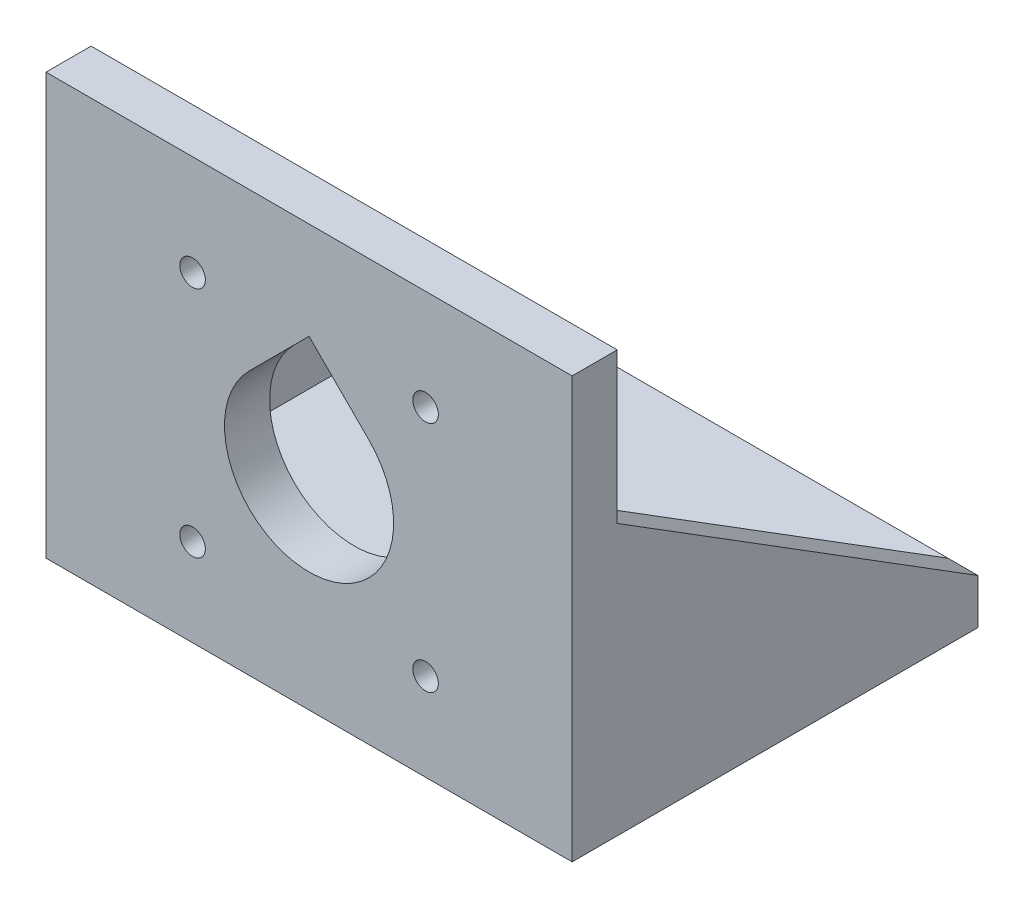
ISO-10303-21;
HEADER;
FILE_DESCRIPTION(('STEP AP214'),'2;1');
FILE_NAME('part.step','',(''),(''),'','','');
FILE_SCHEMA(('AUTOMOTIVE_DESIGN { 1 0 10303 214 1 1 1 1 }'));
ENDSEC;
DATA;
#1=APPLICATION_CONTEXT('core data for automotive mechanical design processes');
#2=APPLICATION_PROTOCOL_DEFINITION('international standard','automotive_design',2000,#1);
#3=PRODUCT_CONTEXT('',#1,'mechanical');
#4=PRODUCT('Part','Part','',(#3));
#5=PRODUCT_RELATED_PRODUCT_CATEGORY('part','',(#4));
#6=PRODUCT_DEFINITION_FORMATION('','',#4);
#7=PRODUCT_DEFINITION_CONTEXT('part definition',#1,'design');
#8=PRODUCT_DEFINITION('design','',#6,#7);
#9=PRODUCT_DEFINITION_SHAPE('','',#8);
#10=(LENGTH_UNIT() NAMED_UNIT(*) SI_UNIT(.MILLI.,.METRE.));
#11=(NAMED_UNIT(*) PLANE_ANGLE_UNIT() SI_UNIT($,.RADIAN.));
#12=(NAMED_UNIT(*) SI_UNIT($,.STERADIAN.) SOLID_ANGLE_UNIT());
#13=UNCERTAINTY_MEASURE_WITH_UNIT(LENGTH_MEASURE(1.E-05),#10,'distance_accuracy_value','');
#14=(GEOMETRIC_REPRESENTATION_CONTEXT(3) GLOBAL_UNCERTAINTY_ASSIGNED_CONTEXT((#13)) GLOBAL_UNIT_ASSIGNED_CONTEXT((#10,
#11,#12)) REPRESENTATION_CONTEXT('',''));
#15=CARTESIAN_POINT('',(0.,0.,0.));
#16=DIRECTION('',(0.,0.,1.));
#17=DIRECTION('',(1.,0.,0.));
#18=AXIS2_PLACEMENT_3D('',#15,#16,#17);
#19=CARTESIAN_POINT('',(0.,0.,0.));
#20=DIRECTION('',(0.,0.,-1.));
#21=DIRECTION('',(-1.,0.,0.));
#22=AXIS2_PLACEMENT_3D('',#19,#20,#21);
#23=PLANE('',#22);
#24=DIRECTION('',(0.707106781186548,0.707106781186548,0.));
#25=VECTOR('',#24,1.);
#26=CARTESIAN_POINT('',(-4.02995128834866,4.02995128834866,0.));
#27=LINE('',#26,#25);
#28=CARTESIAN_POINT('',(27.0450487116513,35.1049512883487,0.));
#29=VERTEX_POINT('',#28);
#30=CARTESIAN_POINT('',(35.,43.0599025766973,0.));
#31=VERTEX_POINT('',#30);
#32=EDGE_CURVE('E268',#29,#31,#27,.T.);
#33=ORIENTED_EDGE('',*,*,#32,.F.);
#34=CARTESIAN_POINT('',(35.,27.15,0.));
#35=DIRECTION('',(0.,0.,-1.));
#36=DIRECTION('',(-1.,0.,0.));
#37=AXIS2_PLACEMENT_3D('',#34,#35,#36);
#38=CIRCLE('',#37,11.25);
#39=CARTESIAN_POINT('',(42.9549512883487,35.1049512883487,0.));
#40=VERTEX_POINT('',#39);
#41=EDGE_CURVE('E149',#40,#29,#38,.T.);
#42=ORIENTED_EDGE('',*,*,#41,.F.);
#43=DIRECTION('',(0.707106781186548,-0.707106781186548,0.));
#44=VECTOR('',#43,1.);
#45=CARTESIAN_POINT('',(39.0299512883487,39.0299512883487,0.));
#46=LINE('',#45,#44);
#47=EDGE_CURVE('E136',#31,#40,#46,.T.);
#48=ORIENTED_EDGE('',*,*,#47,.F.);
#49=EDGE_LOOP('',(#33,#42,#48));
#50=FACE_BOUND('',#49,.T.);
#51=CARTESIAN_POINT('',(50.5,42.65,0.));
#52=DIRECTION('',(0.,0.,-1.));
#53=DIRECTION('',(-1.,0.,0.));
#54=AXIS2_PLACEMENT_3D('',#51,#52,#53);
#55=CIRCLE('',#54,1.7);
#56=CARTESIAN_POINT('',(48.8,42.65,0.));
#57=VERTEX_POINT('',#56);
#58=EDGE_CURVE('E169',#57,#57,#55,.T.);
#59=ORIENTED_EDGE('',*,*,#58,.F.);
#60=EDGE_LOOP('',(#59));
#61=FACE_BOUND('',#60,.T.);
#62=CARTESIAN_POINT('',(50.5,11.65,0.));
#63=DIRECTION('',(0.,0.,-1.));
#64=DIRECTION('',(-1.,0.,0.));
#65=AXIS2_PLACEMENT_3D('',#62,#63,#64);
#66=CIRCLE('',#65,1.7);
#67=CARTESIAN_POINT('',(48.8,11.65,0.));
#68=VERTEX_POINT('',#67);
#69=EDGE_CURVE('E166',#68,#68,#66,.T.);
#70=ORIENTED_EDGE('',*,*,#69,.F.);
#71=EDGE_LOOP('',(#70));
#72=FACE_BOUND('',#71,.T.);
#73=CARTESIAN_POINT('',(19.5,42.65,0.));
#74=DIRECTION('',(0.,0.,-1.));
#75=DIRECTION('',(-1.,0.,0.));
#76=AXIS2_PLACEMENT_3D('',#73,#74,#75);
#77=CIRCLE('',#76,1.7);
#78=CARTESIAN_POINT('',(17.8,42.65,0.));
#79=VERTEX_POINT('',#78);
#80=EDGE_CURVE('E163',#79,#79,#77,.T.);
#81=ORIENTED_EDGE('',*,*,#80,.F.);
#82=EDGE_LOOP('',(#81));
#83=FACE_BOUND('',#82,.T.);
#84=CARTESIAN_POINT('',(19.5,11.65,0.));
#85=DIRECTION('',(0.,0.,-1.));
#86=DIRECTION('',(-1.,0.,0.));
#87=AXIS2_PLACEMENT_3D('',#84,#85,#86);
#88=CIRCLE('',#87,1.7);
#89=CARTESIAN_POINT('',(17.8,11.65,0.));
#90=VERTEX_POINT('',#89);
#91=EDGE_CURVE('E152',#90,#90,#88,.T.);
#92=ORIENTED_EDGE('',*,*,#91,.F.);
#93=EDGE_LOOP('',(#92));
#94=FACE_BOUND('',#93,.T.);
#95=DIRECTION('',(0.,1.,0.));
#96=VECTOR('',#95,1.);
#97=CARTESIAN_POINT('',(70.,0.,0.));
#98=LINE('',#97,#96);
#99=CARTESIAN_POINT('',(70.,36.,0.));
#100=VERTEX_POINT('',#99);
#101=CARTESIAN_POINT('',(70.,56.,0.));
#102=VERTEX_POINT('',#101);
#103=EDGE_CURVE('E226',#100,#102,#98,.T.);
#104=ORIENTED_EDGE('',*,*,#103,.F.);
#105=DIRECTION('',(-1.,0.,0.));
#106=VECTOR('',#105,1.);
#107=CARTESIAN_POINT('',(70.,36.,0.));
#108=LINE('',#107,#106);
#109=CARTESIAN_POINT('',(66.,36.,0.));
#110=VERTEX_POINT('',#109);
#111=EDGE_CURVE('E174',#100,#110,#108,.T.);
#112=ORIENTED_EDGE('',*,*,#111,.T.);
#113=DIRECTION('',(0.,-1.,0.));
#114=VECTOR('',#113,1.);
#115=CARTESIAN_POINT('',(66.,5.99999999999999,0.));
#116=LINE('',#115,#114);
#117=CARTESIAN_POINT('',(66.,5.99999999999999,0.));
#118=VERTEX_POINT('',#117);
#119=EDGE_CURVE('E177',#110,#118,#116,.T.);
#120=ORIENTED_EDGE('',*,*,#119,.T.);
#121=DIRECTION('',(1.,0.,0.));
#122=VECTOR('',#121,1.);
#123=CARTESIAN_POINT('',(0.,6.,0.));
#124=LINE('',#123,#122);
#125=CARTESIAN_POINT('',(4.,6.,0.));
#126=VERTEX_POINT('',#125);
#127=EDGE_CURVE('E238',#126,#118,#124,.T.);
#128=ORIENTED_EDGE('',*,*,#127,.F.);
#129=DIRECTION('',(0.,-1.,0.));
#130=VECTOR('',#129,1.);
#131=CARTESIAN_POINT('',(4.,5.99999999999999,0.));
#132=LINE('',#131,#130);
#133=CARTESIAN_POINT('',(4.,36.,0.));
#134=VERTEX_POINT('',#133);
#135=EDGE_CURVE('E188',#134,#126,#132,.T.);
#136=ORIENTED_EDGE('',*,*,#135,.F.);
#137=DIRECTION('',(-1.,0.,0.));
#138=VECTOR('',#137,1.);
#139=CARTESIAN_POINT('',(4.,36.,0.));
#140=LINE('',#139,#138);
#141=CARTESIAN_POINT('',(0.,36.,0.));
#142=VERTEX_POINT('',#141);
#143=EDGE_CURVE('E199',#134,#142,#140,.T.);
#144=ORIENTED_EDGE('',*,*,#143,.T.);
#145=DIRECTION('',(0.,-1.,0.));
#146=VECTOR('',#145,1.);
#147=CARTESIAN_POINT('',(0.,0.,0.));
#148=LINE('',#147,#146);
#149=CARTESIAN_POINT('',(0.,56.,0.));
#150=VERTEX_POINT('',#149);
#151=EDGE_CURVE('E213',#150,#142,#148,.T.);
#152=ORIENTED_EDGE('',*,*,#151,.F.);
#153=DIRECTION('',(-1.,0.,0.));
#154=VECTOR('',#153,1.);
#155=CARTESIAN_POINT('',(0.,56.,0.));
#156=LINE('',#155,#154);
#157=EDGE_CURVE('E217',#102,#150,#156,.T.);
#158=ORIENTED_EDGE('',*,*,#157,.F.);
#159=EDGE_LOOP('',(#104,#112,#120,#128,#136,#144,#152,#158));
#160=FACE_BOUND('',#159,.T.);
#161=ADVANCED_FACE('F41',(#50,#61,#72,#83,#94,#160),#23,.T.);
#162=CARTESIAN_POINT('',(0.,6.,0.));
#163=DIRECTION('',(0.,1.,0.));
#164=DIRECTION('',(0.,0.,1.));
#165=AXIS2_PLACEMENT_3D('',#162,#163,#164);
#166=PLANE('',#165);
#167=CARTESIAN_POINT('',(8.5,6.,-38.));
#168=DIRECTION('',(0.,1.,0.));
#169=DIRECTION('',(0.,0.,1.));
#170=AXIS2_PLACEMENT_3D('',#167,#168,#169);
#171=CIRCLE('',#170,2.25);
#172=CARTESIAN_POINT('',(8.5,6.,-35.75));
#173=VERTEX_POINT('',#172);
#174=EDGE_CURVE('E262',#173,#173,#171,.T.);
#175=ORIENTED_EDGE('',*,*,#174,.F.);
#176=EDGE_LOOP('',(#175));
#177=FACE_BOUND('',#176,.T.);
#178=CARTESIAN_POINT('',(61.5,6.,-12.));
#179=DIRECTION('',(0.,1.,0.));
#180=DIRECTION('',(0.,0.,1.));
#181=AXIS2_PLACEMENT_3D('',#178,#179,#180);
#182=CIRCLE('',#181,2.24999999999999);
#183=CARTESIAN_POINT('',(61.5,6.,-9.75000000000001));
#184=VERTEX_POINT('',#183);
#185=EDGE_CURVE('E251',#184,#184,#182,.T.);
#186=ORIENTED_EDGE('',*,*,#185,.F.);
#187=EDGE_LOOP('',(#186));
#188=FACE_BOUND('',#187,.T.);
#189=CARTESIAN_POINT('',(61.5,6.,-38.));
#190=DIRECTION('',(0.,1.,0.));
#191=DIRECTION('',(0.,0.,1.));
#192=AXIS2_PLACEMENT_3D('',#189,#190,#191);
#193=CIRCLE('',#192,2.24999999999999);
#194=CARTESIAN_POINT('',(61.5,6.,-35.75));
#195=VERTEX_POINT('',#194);
#196=EDGE_CURVE('E248',#195,#195,#193,.T.);
#197=ORIENTED_EDGE('',*,*,#196,.F.);
#198=EDGE_LOOP('',(#197));
#199=FACE_BOUND('',#198,.T.);
#200=CARTESIAN_POINT('',(8.5,6.,-12.));
#201=DIRECTION('',(0.,1.,0.));
#202=DIRECTION('',(0.,0.,1.));
#203=AXIS2_PLACEMENT_3D('',#200,#201,#202);
#204=CIRCLE('',#203,2.25);
#205=CARTESIAN_POINT('',(8.5,6.,-9.75));
#206=VERTEX_POINT('',#205);
#207=EDGE_CURVE('E245',#206,#206,#204,.T.);
#208=ORIENTED_EDGE('',*,*,#207,.F.);
#209=EDGE_LOOP('',(#208));
#210=FACE_BOUND('',#209,.T.);
#211=ORIENTED_EDGE('',*,*,#127,.T.);
#212=DIRECTION('',(0.,0.,-1.));
#213=VECTOR('',#212,1.);
#214=CARTESIAN_POINT('',(66.,6.,-48.));
#215=LINE('',#214,#213);
#216=CARTESIAN_POINT('',(66.,6.,-48.));
#217=VERTEX_POINT('',#216);
#218=EDGE_CURVE('E175',#118,#217,#215,.T.);
#219=ORIENTED_EDGE('',*,*,#218,.T.);
#220=DIRECTION('',(-1.,0.,0.));
#221=VECTOR('',#220,1.);
#222=CARTESIAN_POINT('',(0.,6.,-48.));
#223=LINE('',#222,#221);
#224=CARTESIAN_POINT('',(4.,6.,-48.));
#225=VERTEX_POINT('',#224);
#226=EDGE_CURVE('E205',#217,#225,#223,.T.);
#227=ORIENTED_EDGE('',*,*,#226,.T.);
#228=DIRECTION('',(0.,0.,-1.));
#229=VECTOR('',#228,1.);
#230=CARTESIAN_POINT('',(4.,6.,-48.));
#231=LINE('',#230,#229);
#232=EDGE_CURVE('E191',#126,#225,#231,.T.);
#233=ORIENTED_EDGE('',*,*,#232,.F.);
#234=EDGE_LOOP('',(#211,#219,#227,#233));
#235=FACE_BOUND('',#234,.T.);
#236=ADVANCED_FACE('F307',(#177,#188,#199,#210,#235),#166,.T.);
#237=CARTESIAN_POINT('',(0.,0.,6.));
#238=DIRECTION('',(1.,0.,0.));
#239=DIRECTION('',(0.,0.,-1.));
#240=AXIS2_PLACEMENT_3D('',#237,#238,#239);
#241=PLANE('',#240);
#242=ORIENTED_EDGE('',*,*,#151,.T.);
#243=DIRECTION('',(0.,0.52999894000318,0.847998304005088));
#244=VECTOR('',#243,1.);
#245=CARTESIAN_POINT('',(0.,36.,0.));
#246=LINE('',#245,#244);
#247=CARTESIAN_POINT('',(0.,6.,-48.));
#248=VERTEX_POINT('',#247);
#249=EDGE_CURVE('E184',#248,#142,#246,.T.);
#250=ORIENTED_EDGE('',*,*,#249,.F.);
#251=DIRECTION('',(0.,-1.,0.));
#252=VECTOR('',#251,1.);
#253=CARTESIAN_POINT('',(0.,6.,-48.));
#254=LINE('',#253,#252);
#255=CARTESIAN_POINT('',(0.,0.,-48.));
#256=VERTEX_POINT('',#255);
#257=EDGE_CURVE('E204',#248,#256,#254,.T.);
#258=ORIENTED_EDGE('',*,*,#257,.T.);
#259=DIRECTION('',(0.,0.,-1.));
#260=VECTOR('',#259,1.);
#261=CARTESIAN_POINT('',(0.,0.,6.));
#262=LINE('',#261,#260);
#263=CARTESIAN_POINT('',(0.,0.,6.));
#264=VERTEX_POINT('',#263);
#265=EDGE_CURVE('E236',#264,#256,#262,.T.);
#266=ORIENTED_EDGE('',*,*,#265,.F.);
#267=DIRECTION('',(0.,-1.,0.));
#268=VECTOR('',#267,1.);
#269=CARTESIAN_POINT('',(0.,0.,6.));
#270=LINE('',#269,#268);
#271=CARTESIAN_POINT('',(0.,56.,6.));
#272=VERTEX_POINT('',#271);
#273=EDGE_CURVE('E214',#272,#264,#270,.T.);
#274=ORIENTED_EDGE('',*,*,#273,.F.);
#275=DIRECTION('',(0.,0.,-1.));
#276=VECTOR('',#275,1.);
#277=CARTESIAN_POINT('',(0.,56.,6.));
#278=LINE('',#277,#276);
#279=EDGE_CURVE('E223',#272,#150,#278,.T.);
#280=ORIENTED_EDGE('',*,*,#279,.T.);
#281=EDGE_LOOP('',(#242,#250,#258,#266,#274,#280));
#282=FACE_BOUND('',#281,.T.);
#283=ADVANCED_FACE('F43',(#282),#241,.F.);
#284=CARTESIAN_POINT('',(0.,0.,6.));
#285=DIRECTION('',(0.,1.,0.));
#286=DIRECTION('',(0.,0.,1.));
#287=AXIS2_PLACEMENT_3D('',#284,#285,#286);
#288=PLANE('',#287);
#289=CARTESIAN_POINT('',(8.5,0.,-38.));
#290=DIRECTION('',(0.,1.,0.));
#291=DIRECTION('',(0.,0.,1.));
#292=AXIS2_PLACEMENT_3D('',#289,#290,#291);
#293=CIRCLE('',#292,2.25);
#294=CARTESIAN_POINT('',(8.5,0.,-35.75));
#295=VERTEX_POINT('',#294);
#296=EDGE_CURVE('E45',#295,#295,#293,.T.);
#297=ORIENTED_EDGE('',*,*,#296,.T.);
#298=EDGE_LOOP('',(#297));
#299=FACE_BOUND('',#298,.T.);
#300=CARTESIAN_POINT('',(61.5,0.,-12.));
#301=DIRECTION('',(0.,1.,0.));
#302=DIRECTION('',(0.,0.,1.));
#303=AXIS2_PLACEMENT_3D('',#300,#301,#302);
#304=CIRCLE('',#303,2.24999999999999);
#305=CARTESIAN_POINT('',(61.5,0.,-9.75000000000001));
#306=VERTEX_POINT('',#305);
#307=EDGE_CURVE('E249',#306,#306,#304,.T.);
#308=ORIENTED_EDGE('',*,*,#307,.T.);
#309=EDGE_LOOP('',(#308));
#310=FACE_BOUND('',#309,.T.);
#311=CARTESIAN_POINT('',(61.5,0.,-38.));
#312=DIRECTION('',(0.,1.,0.));
#313=DIRECTION('',(0.,0.,1.));
#314=AXIS2_PLACEMENT_3D('',#311,#312,#313);
#315=CIRCLE('',#314,2.24999999999999);
#316=CARTESIAN_POINT('',(61.5,0.,-35.75));
#317=VERTEX_POINT('',#316);
#318=EDGE_CURVE('E246',#317,#317,#315,.T.);
#319=ORIENTED_EDGE('',*,*,#318,.T.);
#320=EDGE_LOOP('',(#319));
#321=FACE_BOUND('',#320,.T.);
#322=CARTESIAN_POINT('',(8.5,0.,-12.));
#323=DIRECTION('',(0.,1.,0.));
#324=DIRECTION('',(0.,0.,1.));
#325=AXIS2_PLACEMENT_3D('',#322,#323,#324);
#326=CIRCLE('',#325,2.25);
#327=CARTESIAN_POINT('',(8.5,0.,-9.75));
#328=VERTEX_POINT('',#327);
#329=EDGE_CURVE('E242',#328,#328,#326,.T.);
#330=ORIENTED_EDGE('',*,*,#329,.T.);
#331=EDGE_LOOP('',(#330));
#332=FACE_BOUND('',#331,.T.);
#333=ORIENTED_EDGE('',*,*,#265,.T.);
#334=DIRECTION('',(-1.,0.,0.));
#335=VECTOR('',#334,1.);
#336=CARTESIAN_POINT('',(0.,0.,-48.));
#337=LINE('',#336,#335);
#338=CARTESIAN_POINT('',(70.,0.,-48.));
#339=VERTEX_POINT('',#338);
#340=EDGE_CURVE('E201',#339,#256,#337,.T.);
#341=ORIENTED_EDGE('',*,*,#340,.F.);
#342=DIRECTION('',(0.,0.,-1.));
#343=VECTOR('',#342,1.);
#344=CARTESIAN_POINT('',(70.,0.,6.));
#345=LINE('',#344,#343);
#346=CARTESIAN_POINT('',(70.,0.,6.));
#347=VERTEX_POINT('',#346);
#348=EDGE_CURVE('E234',#347,#339,#345,.T.);
#349=ORIENTED_EDGE('',*,*,#348,.F.);
#350=DIRECTION('',(1.,0.,0.));
#351=VECTOR('',#350,1.);
#352=CARTESIAN_POINT('',(0.,0.,6.));
#353=LINE('',#352,#351);
#354=EDGE_CURVE('E216',#264,#347,#353,.T.);
#355=ORIENTED_EDGE('',*,*,#354,.F.);
#356=EDGE_LOOP('',(#333,#341,#349,#355));
#357=FACE_BOUND('',#356,.T.);
#358=ADVANCED_FACE('F325',(#299,#310,#321,#332,#357),#288,.F.);
#359=CARTESIAN_POINT('',(70.,0.,6.));
#360=DIRECTION('',(-1.,0.,0.));
#361=DIRECTION('',(0.,0.,1.));
#362=AXIS2_PLACEMENT_3D('',#359,#360,#361);
#363=PLANE('',#362);
#364=DIRECTION('',(0.,0.52999894000318,0.847998304005088));
#365=VECTOR('',#364,1.);
#366=CARTESIAN_POINT('',(70.,36.,0.));
#367=LINE('',#366,#365);
#368=CARTESIAN_POINT('',(70.,6.,-48.));
#369=VERTEX_POINT('',#368);
#370=EDGE_CURVE('E172',#369,#100,#367,.T.);
#371=ORIENTED_EDGE('',*,*,#370,.T.);
#372=ORIENTED_EDGE('',*,*,#103,.T.);
#373=DIRECTION('',(0.,0.,-1.));
#374=VECTOR('',#373,1.);
#375=CARTESIAN_POINT('',(70.,56.,6.));
#376=LINE('',#375,#374);
#377=CARTESIAN_POINT('',(70.,56.,6.));
#378=VERTEX_POINT('',#377);
#379=EDGE_CURVE('E231',#378,#102,#376,.T.);
#380=ORIENTED_EDGE('',*,*,#379,.F.);
#381=DIRECTION('',(0.,1.,0.));
#382=VECTOR('',#381,1.);
#383=CARTESIAN_POINT('',(70.,0.,6.));
#384=LINE('',#383,#382);
#385=EDGE_CURVE('E219',#347,#378,#384,.T.);
#386=ORIENTED_EDGE('',*,*,#385,.F.);
#387=ORIENTED_EDGE('',*,*,#348,.T.);
#388=DIRECTION('',(0.,-1.,0.));
#389=VECTOR('',#388,1.);
#390=CARTESIAN_POINT('',(70.,6.,-48.));
#391=LINE('',#390,#389);
#392=EDGE_CURVE('E210',#369,#339,#391,.T.);
#393=ORIENTED_EDGE('',*,*,#392,.F.);
#394=EDGE_LOOP('',(#371,#372,#380,#386,#387,#393));
#395=FACE_BOUND('',#394,.T.);
#396=ADVANCED_FACE('F322',(#395),#363,.F.);
#397=CARTESIAN_POINT('',(0.,56.,6.));
#398=DIRECTION('',(0.,-1.,0.));
#399=DIRECTION('',(0.,0.,-1.));
#400=AXIS2_PLACEMENT_3D('',#397,#398,#399);
#401=PLANE('',#400);
#402=ORIENTED_EDGE('',*,*,#157,.T.);
#403=ORIENTED_EDGE('',*,*,#279,.F.);
#404=DIRECTION('',(-1.,0.,0.));
#405=VECTOR('',#404,1.);
#406=CARTESIAN_POINT('',(0.,56.,6.));
#407=LINE('',#406,#405);
#408=EDGE_CURVE('E221',#378,#272,#407,.T.);
#409=ORIENTED_EDGE('',*,*,#408,.F.);
#410=ORIENTED_EDGE('',*,*,#379,.T.);
#411=EDGE_LOOP('',(#402,#403,#409,#410));
#412=FACE_BOUND('',#411,.T.);
#413=ADVANCED_FACE('F283',(#412),#401,.F.);
#414=CARTESIAN_POINT('',(0.,0.,6.));
#415=DIRECTION('',(0.,0.,-1.));
#416=DIRECTION('',(-1.,0.,0.));
#417=AXIS2_PLACEMENT_3D('',#414,#415,#416);
#418=PLANE('',#417);
#419=CARTESIAN_POINT('',(50.5,42.65,6.));
#420=DIRECTION('',(0.,0.,1.));
#421=DIRECTION('',(1.,0.,0.));
#422=AXIS2_PLACEMENT_3D('',#419,#420,#421);
#423=CIRCLE('',#422,1.7);
#424=CARTESIAN_POINT('',(52.2,42.65,6.));
#425=VERTEX_POINT('',#424);
#426=EDGE_CURVE('E158',#425,#425,#423,.T.);
#427=ORIENTED_EDGE('',*,*,#426,.F.);
#428=EDGE_LOOP('',(#427));
#429=FACE_BOUND('',#428,.T.);
#430=CARTESIAN_POINT('',(50.5,11.65,6.));
#431=DIRECTION('',(0.,0.,1.));
#432=DIRECTION('',(1.,0.,0.));
#433=AXIS2_PLACEMENT_3D('',#430,#431,#432);
#434=CIRCLE('',#433,1.7);
#435=CARTESIAN_POINT('',(52.2,11.65,6.));
#436=VERTEX_POINT('',#435);
#437=EDGE_CURVE('E271',#436,#436,#434,.T.);
#438=ORIENTED_EDGE('',*,*,#437,.F.);
#439=EDGE_LOOP('',(#438));
#440=FACE_BOUND('',#439,.T.);
#441=CARTESIAN_POINT('',(19.5,42.65,6.));
#442=DIRECTION('',(0.,0.,1.));
#443=DIRECTION('',(1.,0.,0.));
#444=AXIS2_PLACEMENT_3D('',#441,#442,#443);
#445=CIRCLE('',#444,1.7);
#446=CARTESIAN_POINT('',(21.2,42.65,6.));
#447=VERTEX_POINT('',#446);
#448=EDGE_CURVE('E155',#447,#447,#445,.T.);
#449=ORIENTED_EDGE('',*,*,#448,.F.);
#450=EDGE_LOOP('',(#449));
#451=FACE_BOUND('',#450,.T.);
#452=CARTESIAN_POINT('',(19.5,11.65,6.));
#453=DIRECTION('',(0.,0.,1.));
#454=DIRECTION('',(1.,0.,0.));
#455=AXIS2_PLACEMENT_3D('',#452,#453,#454);
#456=CIRCLE('',#455,1.7);
#457=CARTESIAN_POINT('',(21.2,11.65,6.));
#458=VERTEX_POINT('',#457);
#459=EDGE_CURVE('E150',#458,#458,#456,.T.);
#460=ORIENTED_EDGE('',*,*,#459,.F.);
#461=EDGE_LOOP('',(#460));
#462=FACE_BOUND('',#461,.T.);
#463=CARTESIAN_POINT('',(35.,27.15,6.));
#464=DIRECTION('',(0.,0.,1.));
#465=DIRECTION('',(1.,0.,0.));
#466=AXIS2_PLACEMENT_3D('',#463,#464,#465);
#467=CIRCLE('',#466,11.25);
#468=CARTESIAN_POINT('',(27.0450487116513,35.1049512883487,6.));
#469=VERTEX_POINT('',#468);
#470=CARTESIAN_POINT('',(42.9549512883487,35.1049512883487,6.));
#471=VERTEX_POINT('',#470);
#472=EDGE_CURVE('E145',#469,#471,#467,.T.);
#473=ORIENTED_EDGE('',*,*,#472,.F.);
#474=DIRECTION('',(-0.707106781186547,-0.707106781186547,0.));
#475=VECTOR('',#474,1.);
#476=CARTESIAN_POINT('',(35.,43.0599025766973,6.));
#477=LINE('',#476,#475);
#478=CARTESIAN_POINT('',(35.,43.0599025766973,6.));
#479=VERTEX_POINT('',#478);
#480=EDGE_CURVE('E58',#479,#469,#477,.T.);
#481=ORIENTED_EDGE('',*,*,#480,.F.);
#482=DIRECTION('',(-0.707106781186547,0.707106781186547,0.));
#483=VECTOR('',#482,1.);
#484=CARTESIAN_POINT('',(42.9549512883487,35.1049512883487,6.));
#485=LINE('',#484,#483);
#486=EDGE_CURVE('E134',#471,#479,#485,.T.);
#487=ORIENTED_EDGE('',*,*,#486,.F.);
#488=EDGE_LOOP('',(#473,#481,#487));
#489=FACE_BOUND('',#488,.T.);
#490=ORIENTED_EDGE('',*,*,#273,.T.);
#491=ORIENTED_EDGE('',*,*,#354,.T.);
#492=ORIENTED_EDGE('',*,*,#385,.T.);
#493=ORIENTED_EDGE('',*,*,#408,.T.);
#494=EDGE_LOOP('',(#490,#491,#492,#493));
#495=FACE_BOUND('',#494,.T.);
#496=ADVANCED_FACE('F143',(#429,#440,#451,#462,#489,#495),#418,.F.);
#497=CARTESIAN_POINT('',(0.,6.,-48.));
#498=DIRECTION('',(0.,0.,1.));
#499=DIRECTION('',(1.,0.,0.));
#500=AXIS2_PLACEMENT_3D('',#497,#498,#499);
#501=PLANE('',#500);
#502=ORIENTED_EDGE('',*,*,#340,.T.);
#503=ORIENTED_EDGE('',*,*,#257,.F.);
#504=DIRECTION('',(-1.,0.,0.));
#505=VECTOR('',#504,1.);
#506=CARTESIAN_POINT('',(4.,6.,-48.));
#507=LINE('',#506,#505);
#508=EDGE_CURVE('E194',#225,#248,#507,.T.);
#509=ORIENTED_EDGE('',*,*,#508,.F.);
#510=ORIENTED_EDGE('',*,*,#226,.F.);
#511=EDGE_CURVE('E202',#369,#217,#223,.T.);
#512=ORIENTED_EDGE('',*,*,#511,.F.);
#513=ORIENTED_EDGE('',*,*,#392,.T.);
#514=EDGE_LOOP('',(#502,#503,#509,#510,#512,#513));
#515=FACE_BOUND('',#514,.T.);
#516=ADVANCED_FACE('F282',(#515),#501,.F.);
#517=CARTESIAN_POINT('',(4.,36.,0.));
#518=DIRECTION('',(0.,-0.847998304005088,0.52999894000318));
#519=DIRECTION('',(0.,-0.52999894000318,-0.847998304005088));
#520=AXIS2_PLACEMENT_3D('',#517,#518,#519);
#521=PLANE('',#520);
#522=ORIENTED_EDGE('',*,*,#249,.T.);
#523=ORIENTED_EDGE('',*,*,#143,.F.);
#524=DIRECTION('',(0.,0.52999894000318,0.847998304005088));
#525=VECTOR('',#524,1.);
#526=CARTESIAN_POINT('',(4.,36.,0.));
#527=LINE('',#526,#525);
#528=EDGE_CURVE('E185',#225,#134,#527,.T.);
#529=ORIENTED_EDGE('',*,*,#528,.F.);
#530=ORIENTED_EDGE('',*,*,#508,.T.);
#531=EDGE_LOOP('',(#522,#523,#529,#530));
#532=FACE_BOUND('',#531,.T.);
#533=ADVANCED_FACE('F354',(#532),#521,.F.);
#534=CARTESIAN_POINT('',(4.,0.,0.));
#535=DIRECTION('',(1.,0.,0.));
#536=DIRECTION('',(0.,0.,-1.));
#537=AXIS2_PLACEMENT_3D('',#534,#535,#536);
#538=PLANE('',#537);
#539=ORIENTED_EDGE('',*,*,#528,.T.);
#540=ORIENTED_EDGE('',*,*,#135,.T.);
#541=ORIENTED_EDGE('',*,*,#232,.T.);
#542=EDGE_LOOP('',(#539,#540,#541));
#543=FACE_BOUND('',#542,.T.);
#544=ADVANCED_FACE('F358',(#543),#538,.T.);
#545=CARTESIAN_POINT('',(70.,36.,0.));
#546=DIRECTION('',(0.,-0.847998304005088,0.52999894000318));
#547=DIRECTION('',(0.,-0.52999894000318,-0.847998304005088));
#548=AXIS2_PLACEMENT_3D('',#545,#546,#547);
#549=PLANE('',#548);
#550=DIRECTION('',(0.,0.52999894000318,0.847998304005088));
#551=VECTOR('',#550,1.);
#552=CARTESIAN_POINT('',(66.,36.,0.));
#553=LINE('',#552,#551);
#554=EDGE_CURVE('E66',#217,#110,#553,.T.);
#555=ORIENTED_EDGE('',*,*,#554,.T.);
#556=ORIENTED_EDGE('',*,*,#111,.F.);
#557=ORIENTED_EDGE('',*,*,#370,.F.);
#558=ORIENTED_EDGE('',*,*,#511,.T.);
#559=EDGE_LOOP('',(#555,#556,#557,#558));
#560=FACE_BOUND('',#559,.T.);
#561=ADVANCED_FACE('F365',(#560),#549,.F.);
#562=CARTESIAN_POINT('',(66.,0.,0.));
#563=DIRECTION('',(1.,0.,0.));
#564=DIRECTION('',(0.,0.,-1.));
#565=AXIS2_PLACEMENT_3D('',#562,#563,#564);
#566=PLANE('',#565);
#567=ORIENTED_EDGE('',*,*,#554,.F.);
#568=ORIENTED_EDGE('',*,*,#218,.F.);
#569=ORIENTED_EDGE('',*,*,#119,.F.);
#570=EDGE_LOOP('',(#567,#568,#569));
#571=FACE_BOUND('',#570,.T.);
#572=ADVANCED_FACE('F303',(#571),#566,.F.);
#573=CARTESIAN_POINT('',(35.,27.15,-48.));
#574=DIRECTION('',(0.,0.,1.));
#575=DIRECTION('',(1.,0.,0.));
#576=AXIS2_PLACEMENT_3D('',#573,#574,#575);
#577=CYLINDRICAL_SURFACE('',#576,11.25);
#578=ORIENTED_EDGE('',*,*,#472,.T.);
#579=DIRECTION('',(0.,0.,1.));
#580=VECTOR('',#579,1.);
#581=CARTESIAN_POINT('',(42.9549512883487,35.1049512883487,-48.));
#582=LINE('',#581,#580);
#583=EDGE_CURVE('E11',#471,#40,#582,.F.);
#584=ORIENTED_EDGE('',*,*,#583,.T.);
#585=ORIENTED_EDGE('',*,*,#41,.T.);
#586=DIRECTION('',(0.,0.,1.));
#587=VECTOR('',#586,1.);
#588=CARTESIAN_POINT('',(27.0450487116513,35.1049512883487,-48.));
#589=LINE('',#588,#587);
#590=EDGE_CURVE('E50',#29,#469,#589,.T.);
#591=ORIENTED_EDGE('',*,*,#590,.T.);
#592=EDGE_LOOP('',(#578,#584,#585,#591));
#593=FACE_BOUND('',#592,.T.);
#594=ADVANCED_FACE('F148',(#593),#577,.F.);
#595=CARTESIAN_POINT('',(19.5,11.65,-48.));
#596=DIRECTION('',(0.,0.,1.));
#597=DIRECTION('',(1.,0.,0.));
#598=AXIS2_PLACEMENT_3D('',#595,#596,#597);
#599=CYLINDRICAL_SURFACE('',#598,1.7);
#600=ORIENTED_EDGE('',*,*,#91,.T.);
#601=EDGE_LOOP('',(#600));
#602=FACE_BOUND('',#601,.T.);
#603=ORIENTED_EDGE('',*,*,#459,.T.);
#604=EDGE_LOOP('',(#603));
#605=FACE_BOUND('',#604,.T.);
#606=ADVANCED_FACE('F290',(#602,#605),#599,.F.);
#607=CARTESIAN_POINT('',(19.5,42.65,-48.));
#608=DIRECTION('',(0.,0.,1.));
#609=DIRECTION('',(1.,0.,0.));
#610=AXIS2_PLACEMENT_3D('',#607,#608,#609);
#611=CYLINDRICAL_SURFACE('',#610,1.7);
#612=ORIENTED_EDGE('',*,*,#80,.T.);
#613=EDGE_LOOP('',(#612));
#614=FACE_BOUND('',#613,.T.);
#615=ORIENTED_EDGE('',*,*,#448,.T.);
#616=EDGE_LOOP('',(#615));
#617=FACE_BOUND('',#616,.T.);
#618=ADVANCED_FACE('F292',(#614,#617),#611,.F.);
#619=CARTESIAN_POINT('',(50.5,11.65,-48.));
#620=DIRECTION('',(0.,0.,1.));
#621=DIRECTION('',(1.,0.,0.));
#622=AXIS2_PLACEMENT_3D('',#619,#620,#621);
#623=CYLINDRICAL_SURFACE('',#622,1.7);
#624=ORIENTED_EDGE('',*,*,#69,.T.);
#625=EDGE_LOOP('',(#624));
#626=FACE_BOUND('',#625,.T.);
#627=ORIENTED_EDGE('',*,*,#437,.T.);
#628=EDGE_LOOP('',(#627));
#629=FACE_BOUND('',#628,.T.);
#630=ADVANCED_FACE('F299',(#626,#629),#623,.F.);
#631=CARTESIAN_POINT('',(50.5,42.65,-48.));
#632=DIRECTION('',(0.,0.,1.));
#633=DIRECTION('',(1.,0.,0.));
#634=AXIS2_PLACEMENT_3D('',#631,#632,#633);
#635=CYLINDRICAL_SURFACE('',#634,1.7);
#636=ORIENTED_EDGE('',*,*,#58,.T.);
#637=EDGE_LOOP('',(#636));
#638=FACE_BOUND('',#637,.T.);
#639=ORIENTED_EDGE('',*,*,#426,.T.);
#640=EDGE_LOOP('',(#639));
#641=FACE_BOUND('',#640,.T.);
#642=ADVANCED_FACE('F278',(#638,#641),#635,.F.);
#643=CARTESIAN_POINT('',(35.,43.0599025766973,-48.));
#644=DIRECTION('',(-0.707106781186548,0.707106781186548,0.));
#645=DIRECTION('',(-0.707106781186548,-0.707106781186548,0.));
#646=AXIS2_PLACEMENT_3D('',#643,#644,#645);
#647=PLANE('',#646);
#648=ORIENTED_EDGE('',*,*,#32,.T.);
#649=DIRECTION('',(0.,0.,1.));
#650=VECTOR('',#649,1.);
#651=CARTESIAN_POINT('',(35.,43.0599025766973,-48.));
#652=LINE('',#651,#650);
#653=EDGE_CURVE('E146',#31,#479,#652,.T.);
#654=ORIENTED_EDGE('',*,*,#653,.T.);
#655=ORIENTED_EDGE('',*,*,#480,.T.);
#656=ORIENTED_EDGE('',*,*,#590,.F.);
#657=EDGE_LOOP('',(#648,#654,#655,#656));
#658=FACE_BOUND('',#657,.T.);
#659=ADVANCED_FACE('F447',(#658),#647,.F.);
#660=CARTESIAN_POINT('',(42.9549512883487,35.1049512883487,-48.));
#661=DIRECTION('',(0.707106781186548,0.707106781186548,0.));
#662=DIRECTION('',(-0.707106781186548,0.707106781186548,0.));
#663=AXIS2_PLACEMENT_3D('',#660,#661,#662);
#664=PLANE('',#663);
#665=ORIENTED_EDGE('',*,*,#47,.T.);
#666=ORIENTED_EDGE('',*,*,#583,.F.);
#667=ORIENTED_EDGE('',*,*,#486,.T.);
#668=ORIENTED_EDGE('',*,*,#653,.F.);
#669=EDGE_LOOP('',(#665,#666,#667,#668));
#670=FACE_BOUND('',#669,.T.);
#671=ADVANCED_FACE('F132',(#670),#664,.F.);
#672=CARTESIAN_POINT('',(8.5,-1.2E-05,-12.));
#673=DIRECTION('',(0.,1.,0.));
#674=DIRECTION('',(0.,0.,1.));
#675=AXIS2_PLACEMENT_3D('',#672,#673,#674);
#676=CYLINDRICAL_SURFACE('',#675,2.25);
#677=CARTESIAN_POINT('',(8.5,6.,-9.75));
#678=CARTESIAN_POINT('',(8.5,5.9375,-9.75));
#679=CARTESIAN_POINT('',(8.5,5.875,-9.75));
#680=CARTESIAN_POINT('',(8.5,5.75,-9.75));
#681=CARTESIAN_POINT('',(8.5,5.6875,-9.75));
#682=CARTESIAN_POINT('',(8.5,5.5625,-9.75));
#683=CARTESIAN_POINT('',(8.5,5.5,-9.75));
#684=CARTESIAN_POINT('',(8.5,5.375,-9.75));
#685=CARTESIAN_POINT('',(8.5,5.3125,-9.75));
#686=CARTESIAN_POINT('',(8.5,5.1875,-9.75));
#687=CARTESIAN_POINT('',(8.5,5.125,-9.75));
#688=CARTESIAN_POINT('',(8.5,5.,-9.75));
#689=CARTESIAN_POINT('',(8.5,4.9375,-9.75));
#690=CARTESIAN_POINT('',(8.5,4.8125,-9.75));
#691=CARTESIAN_POINT('',(8.5,4.75,-9.75));
#692=CARTESIAN_POINT('',(8.5,4.625,-9.75));
#693=CARTESIAN_POINT('',(8.5,4.5625,-9.75));
#694=CARTESIAN_POINT('',(8.5,4.4375,-9.75));
#695=CARTESIAN_POINT('',(8.5,4.375,-9.75));
#696=CARTESIAN_POINT('',(8.5,4.25,-9.75));
#697=CARTESIAN_POINT('',(8.5,4.1875,-9.75));
#698=CARTESIAN_POINT('',(8.5,4.0625,-9.75));
#699=CARTESIAN_POINT('',(8.5,4.,-9.75));
#700=CARTESIAN_POINT('',(8.5,3.875,-9.75));
#701=CARTESIAN_POINT('',(8.5,3.8125,-9.75));
#702=CARTESIAN_POINT('',(8.5,3.6875,-9.75));
#703=CARTESIAN_POINT('',(8.5,3.625,-9.75));
#704=CARTESIAN_POINT('',(8.5,3.5,-9.75));
#705=CARTESIAN_POINT('',(8.5,3.4375,-9.75));
#706=CARTESIAN_POINT('',(8.5,3.3125,-9.75));
#707=CARTESIAN_POINT('',(8.5,3.25,-9.75));
#708=CARTESIAN_POINT('',(8.5,3.125,-9.75));
#709=CARTESIAN_POINT('',(8.5,3.0625,-9.75));
#710=CARTESIAN_POINT('',(8.5,2.9375,-9.75));
#711=CARTESIAN_POINT('',(8.5,2.875,-9.75));
#712=CARTESIAN_POINT('',(8.5,2.75,-9.75));
#713=CARTESIAN_POINT('',(8.5,2.6875,-9.75));
#714=CARTESIAN_POINT('',(8.5,2.5625,-9.75));
#715=CARTESIAN_POINT('',(8.5,2.5,-9.75));
#716=CARTESIAN_POINT('',(8.5,2.375,-9.75));
#717=CARTESIAN_POINT('',(8.5,2.3125,-9.75));
#718=CARTESIAN_POINT('',(8.5,2.1875,-9.75));
#719=CARTESIAN_POINT('',(8.5,2.125,-9.75));
#720=CARTESIAN_POINT('',(8.5,2.,-9.75));
#721=CARTESIAN_POINT('',(8.5,1.9375,-9.75));
#722=CARTESIAN_POINT('',(8.5,1.8125,-9.75));
#723=CARTESIAN_POINT('',(8.5,1.75,-9.75));
#724=CARTESIAN_POINT('',(8.5,1.625,-9.75));
#725=CARTESIAN_POINT('',(8.5,1.5625,-9.75));
#726=CARTESIAN_POINT('',(8.5,1.4375,-9.75));
#727=CARTESIAN_POINT('',(8.5,1.375,-9.75));
#728=CARTESIAN_POINT('',(8.5,1.25,-9.75));
#729=CARTESIAN_POINT('',(8.5,1.1875,-9.75));
#730=CARTESIAN_POINT('',(8.5,1.0625,-9.75));
#731=CARTESIAN_POINT('',(8.5,1.,-9.75));
#732=CARTESIAN_POINT('',(8.5,0.875,-9.75));
#733=CARTESIAN_POINT('',(8.5,0.8125,-9.75));
#734=CARTESIAN_POINT('',(8.5,0.6875,-9.75));
#735=CARTESIAN_POINT('',(8.5,0.625,-9.75));
#736=CARTESIAN_POINT('',(8.5,0.5,-9.75));
#737=CARTESIAN_POINT('',(8.5,0.4375,-9.75));
#738=CARTESIAN_POINT('',(8.5,0.3125,-9.75));
#739=CARTESIAN_POINT('',(8.5,0.25,-9.75));
#740=CARTESIAN_POINT('',(8.5,0.125,-9.75));
#741=CARTESIAN_POINT('',(8.5,0.0624999999999999,-9.75));
#742=CARTESIAN_POINT('',(8.5,0.,-9.75));
#743=B_SPLINE_CURVE_WITH_KNOTS('',3,(#677,#678,#679,#680,#681,#682,#683,#684,#685,#686,#687,
#688,#689,#690,#691,#692,#693,#694,#695,#696,#697,#698,#699,#700,#701,#702,#703,#704,#705,#706,
#707,#708,#709,#710,#711,#712,#713,#714,#715,#716,#717,#718,#719,#720,#721,#722,#723,#724,#725,
#726,#727,#728,#729,#730,#731,#732,#733,#734,#735,#736,#737,#738,#739,#740,#741,#742),
.UNSPECIFIED.,.F.,.F.,(4,2,2,2,2,2,2,2,2,2,2,2,2,2,2,2,2,2,2,2,2,2,2,2,2,2,2,2,2,2,2,2,4),(0.,
0.1875,0.375,0.5625,0.75,0.9375,1.125,1.3125,1.5,1.6875,1.875,2.0625,2.25,2.4375,2.625,2.8125,
3.,3.1875,3.375,3.5625,3.75,3.9375,4.125,4.3125,4.5,4.6875,4.875,5.0625,5.25,5.4375,5.625,
5.8125,6.),.UNSPECIFIED.);
#744=EDGE_CURVE('BSEAM457',#206,#328,#743,.T.);
#745=ORIENTED_EDGE('',*,*,#207,.T.);
#746=ORIENTED_EDGE('',*,*,#329,.F.);
#747=ORIENTED_EDGE('',*,*,#744,.T.);
#748=ORIENTED_EDGE('',*,*,#744,.F.);
#749=EDGE_LOOP('',(#745,#747,#746,#748));
#750=FACE_BOUND('',#749,.T.);
#751=ADVANCED_FACE('F457',(#750),#676,.F.);
#752=CARTESIAN_POINT('',(61.5,-1.2E-05,-38.));
#753=DIRECTION('',(0.,1.,0.));
#754=DIRECTION('',(0.,0.,1.));
#755=AXIS2_PLACEMENT_3D('',#752,#753,#754);
#756=CYLINDRICAL_SURFACE('',#755,2.24999999999999);
#757=CARTESIAN_POINT('',(61.5,6.,-35.75));
#758=CARTESIAN_POINT('',(61.5,5.9375,-35.75));
#759=CARTESIAN_POINT('',(61.5,5.875,-35.75));
#760=CARTESIAN_POINT('',(61.5,5.75,-35.75));
#761=CARTESIAN_POINT('',(61.5,5.6875,-35.75));
#762=CARTESIAN_POINT('',(61.5,5.5625,-35.75));
#763=CARTESIAN_POINT('',(61.5,5.5,-35.75));
#764=CARTESIAN_POINT('',(61.5,5.375,-35.75));
#765=CARTESIAN_POINT('',(61.5,5.3125,-35.75));
#766=CARTESIAN_POINT('',(61.5,5.1875,-35.75));
#767=CARTESIAN_POINT('',(61.5,5.125,-35.75));
#768=CARTESIAN_POINT('',(61.5,5.,-35.75));
#769=CARTESIAN_POINT('',(61.5,4.9375,-35.75));
#770=CARTESIAN_POINT('',(61.5,4.8125,-35.75));
#771=CARTESIAN_POINT('',(61.5,4.75,-35.75));
#772=CARTESIAN_POINT('',(61.5,4.625,-35.75));
#773=CARTESIAN_POINT('',(61.5,4.5625,-35.75));
#774=CARTESIAN_POINT('',(61.5,4.4375,-35.75));
#775=CARTESIAN_POINT('',(61.5,4.375,-35.75));
#776=CARTESIAN_POINT('',(61.5,4.25,-35.75));
#777=CARTESIAN_POINT('',(61.5,4.1875,-35.75));
#778=CARTESIAN_POINT('',(61.5,4.0625,-35.75));
#779=CARTESIAN_POINT('',(61.5,4.,-35.75));
#780=CARTESIAN_POINT('',(61.5,3.875,-35.75));
#781=CARTESIAN_POINT('',(61.5,3.8125,-35.75));
#782=CARTESIAN_POINT('',(61.5,3.6875,-35.75));
#783=CARTESIAN_POINT('',(61.5,3.625,-35.75));
#784=CARTESIAN_POINT('',(61.5,3.5,-35.75));
#785=CARTESIAN_POINT('',(61.5,3.4375,-35.75));
#786=CARTESIAN_POINT('',(61.5,3.3125,-35.75));
#787=CARTESIAN_POINT('',(61.5,3.25,-35.75));
#788=CARTESIAN_POINT('',(61.5,3.125,-35.75));
#789=CARTESIAN_POINT('',(61.5,3.0625,-35.75));
#790=CARTESIAN_POINT('',(61.5,2.9375,-35.75));
#791=CARTESIAN_POINT('',(61.5,2.875,-35.75));
#792=CARTESIAN_POINT('',(61.5,2.75,-35.75));
#793=CARTESIAN_POINT('',(61.5,2.6875,-35.75));
#794=CARTESIAN_POINT('',(61.5,2.5625,-35.75));
#795=CARTESIAN_POINT('',(61.5,2.5,-35.75));
#796=CARTESIAN_POINT('',(61.5,2.375,-35.75));
#797=CARTESIAN_POINT('',(61.5,2.3125,-35.75));
#798=CARTESIAN_POINT('',(61.5,2.1875,-35.75));
#799=CARTESIAN_POINT('',(61.5,2.125,-35.75));
#800=CARTESIAN_POINT('',(61.5,2.,-35.75));
#801=CARTESIAN_POINT('',(61.5,1.9375,-35.75));
#802=CARTESIAN_POINT('',(61.5,1.8125,-35.75));
#803=CARTESIAN_POINT('',(61.5,1.75,-35.75));
#804=CARTESIAN_POINT('',(61.5,1.625,-35.75));
#805=CARTESIAN_POINT('',(61.5,1.5625,-35.75));
#806=CARTESIAN_POINT('',(61.5,1.4375,-35.75));
#807=CARTESIAN_POINT('',(61.5,1.375,-35.75));
#808=CARTESIAN_POINT('',(61.5,1.25,-35.75));
#809=CARTESIAN_POINT('',(61.5,1.1875,-35.75));
#810=CARTESIAN_POINT('',(61.5,1.0625,-35.75));
#811=CARTESIAN_POINT('',(61.5,1.,-35.75));
#812=CARTESIAN_POINT('',(61.5,0.875,-35.75));
#813=CARTESIAN_POINT('',(61.5,0.8125,-35.75));
#814=CARTESIAN_POINT('',(61.5,0.6875,-35.75));
#815=CARTESIAN_POINT('',(61.5,0.625,-35.75));
#816=CARTESIAN_POINT('',(61.5,0.5,-35.75));
#817=CARTESIAN_POINT('',(61.5,0.4375,-35.75));
#818=CARTESIAN_POINT('',(61.5,0.3125,-35.75));
#819=CARTESIAN_POINT('',(61.5,0.25,-35.75));
#820=CARTESIAN_POINT('',(61.5,0.125,-35.75));
#821=CARTESIAN_POINT('',(61.5,0.0624999999999999,-35.75));
#822=CARTESIAN_POINT('',(61.5,0.,-35.75));
#823=B_SPLINE_CURVE_WITH_KNOTS('',3,(#757,#758,#759,#760,#761,#762,#763,#764,#765,#766,#767,
#768,#769,#770,#771,#772,#773,#774,#775,#776,#777,#778,#779,#780,#781,#782,#783,#784,#785,#786,
#787,#788,#789,#790,#791,#792,#793,#794,#795,#796,#797,#798,#799,#800,#801,#802,#803,#804,#805,
#806,#807,#808,#809,#810,#811,#812,#813,#814,#815,#816,#817,#818,#819,#820,#821,#822),
.UNSPECIFIED.,.F.,.F.,(4,2,2,2,2,2,2,2,2,2,2,2,2,2,2,2,2,2,2,2,2,2,2,2,2,2,2,2,2,2,2,2,4),(0.,
0.1875,0.375,0.5625,0.75,0.9375,1.125,1.3125,1.5,1.6875,1.875,2.0625,2.25,2.4375,2.625,2.8125,
3.,3.1875,3.375,3.5625,3.75,3.9375,4.125,4.3125,4.5,4.6875,4.875,5.0625,5.25,5.4375,5.625,
5.8125,6.),.UNSPECIFIED.);
#824=EDGE_CURVE('BSEAM510',#195,#317,#823,.T.);
#825=ORIENTED_EDGE('',*,*,#196,.T.);
#826=ORIENTED_EDGE('',*,*,#318,.F.);
#827=ORIENTED_EDGE('',*,*,#824,.T.);
#828=ORIENTED_EDGE('',*,*,#824,.F.);
#829=EDGE_LOOP('',(#825,#827,#826,#828));
#830=FACE_BOUND('',#829,.T.);
#831=ADVANCED_FACE('F510',(#830),#756,.F.);
#832=CARTESIAN_POINT('',(61.5,-1.2E-05,-12.));
#833=DIRECTION('',(0.,1.,0.));
#834=DIRECTION('',(0.,0.,1.));
#835=AXIS2_PLACEMENT_3D('',#832,#833,#834);
#836=CYLINDRICAL_SURFACE('',#835,2.24999999999999);
#837=CARTESIAN_POINT('',(61.5,6.,-9.75000000000001));
#838=CARTESIAN_POINT('',(61.5,5.9375,-9.75000000000001));
#839=CARTESIAN_POINT('',(61.5,5.875,-9.75000000000001));
#840=CARTESIAN_POINT('',(61.5,5.75,-9.75000000000001));
#841=CARTESIAN_POINT('',(61.5,5.6875,-9.75000000000001));
#842=CARTESIAN_POINT('',(61.5,5.5625,-9.75000000000001));
#843=CARTESIAN_POINT('',(61.5,5.5,-9.75000000000001));
#844=CARTESIAN_POINT('',(61.5,5.375,-9.75000000000001));
#845=CARTESIAN_POINT('',(61.5,5.3125,-9.75000000000001));
#846=CARTESIAN_POINT('',(61.5,5.1875,-9.75000000000001));
#847=CARTESIAN_POINT('',(61.5,5.125,-9.75000000000001));
#848=CARTESIAN_POINT('',(61.5,5.,-9.75000000000001));
#849=CARTESIAN_POINT('',(61.5,4.9375,-9.75000000000001));
#850=CARTESIAN_POINT('',(61.5,4.8125,-9.75000000000001));
#851=CARTESIAN_POINT('',(61.5,4.75,-9.75000000000001));
#852=CARTESIAN_POINT('',(61.5,4.625,-9.75000000000001));
#853=CARTESIAN_POINT('',(61.5,4.5625,-9.75000000000001));
#854=CARTESIAN_POINT('',(61.5,4.4375,-9.75000000000001));
#855=CARTESIAN_POINT('',(61.5,4.375,-9.75000000000001));
#856=CARTESIAN_POINT('',(61.5,4.25,-9.75000000000001));
#857=CARTESIAN_POINT('',(61.5,4.1875,-9.75000000000001));
#858=CARTESIAN_POINT('',(61.5,4.0625,-9.75000000000001));
#859=CARTESIAN_POINT('',(61.5,4.,-9.75000000000001));
#860=CARTESIAN_POINT('',(61.5,3.875,-9.75000000000001));
#861=CARTESIAN_POINT('',(61.5,3.8125,-9.75000000000001));
#862=CARTESIAN_POINT('',(61.5,3.6875,-9.75000000000001));
#863=CARTESIAN_POINT('',(61.5,3.625,-9.75000000000001));
#864=CARTESIAN_POINT('',(61.5,3.5,-9.75000000000001));
#865=CARTESIAN_POINT('',(61.5,3.4375,-9.75000000000001));
#866=CARTESIAN_POINT('',(61.5,3.3125,-9.75000000000001));
#867=CARTESIAN_POINT('',(61.5,3.25,-9.75000000000001));
#868=CARTESIAN_POINT('',(61.5,3.125,-9.75000000000001));
#869=CARTESIAN_POINT('',(61.5,3.0625,-9.75000000000001));
#870=CARTESIAN_POINT('',(61.5,2.9375,-9.75000000000001));
#871=CARTESIAN_POINT('',(61.5,2.875,-9.75000000000001));
#872=CARTESIAN_POINT('',(61.5,2.75,-9.75000000000001));
#873=CARTESIAN_POINT('',(61.5,2.6875,-9.75000000000001));
#874=CARTESIAN_POINT('',(61.5,2.5625,-9.75000000000001));
#875=CARTESIAN_POINT('',(61.5,2.5,-9.75000000000001));
#876=CARTESIAN_POINT('',(61.5,2.375,-9.75000000000001));
#877=CARTESIAN_POINT('',(61.5,2.3125,-9.75000000000001));
#878=CARTESIAN_POINT('',(61.5,2.1875,-9.75000000000001));
#879=CARTESIAN_POINT('',(61.5,2.125,-9.75000000000001));
#880=CARTESIAN_POINT('',(61.5,2.,-9.75000000000001));
#881=CARTESIAN_POINT('',(61.5,1.9375,-9.75000000000001));
#882=CARTESIAN_POINT('',(61.5,1.8125,-9.75000000000001));
#883=CARTESIAN_POINT('',(61.5,1.75,-9.75000000000001));
#884=CARTESIAN_POINT('',(61.5,1.625,-9.75000000000001));
#885=CARTESIAN_POINT('',(61.5,1.5625,-9.75000000000001));
#886=CARTESIAN_POINT('',(61.5,1.4375,-9.75000000000001));
#887=CARTESIAN_POINT('',(61.5,1.375,-9.75000000000001));
#888=CARTESIAN_POINT('',(61.5,1.25,-9.75000000000001));
#889=CARTESIAN_POINT('',(61.5,1.1875,-9.75000000000001));
#890=CARTESIAN_POINT('',(61.5,1.0625,-9.75000000000001));
#891=CARTESIAN_POINT('',(61.5,1.,-9.75000000000001));
#892=CARTESIAN_POINT('',(61.5,0.875,-9.75000000000001));
#893=CARTESIAN_POINT('',(61.5,0.8125,-9.75000000000001));
#894=CARTESIAN_POINT('',(61.5,0.6875,-9.75000000000001));
#895=CARTESIAN_POINT('',(61.5,0.625,-9.75000000000001));
#896=CARTESIAN_POINT('',(61.5,0.5,-9.75000000000001));
#897=CARTESIAN_POINT('',(61.5,0.4375,-9.75000000000001));
#898=CARTESIAN_POINT('',(61.5,0.3125,-9.75000000000001));
#899=CARTESIAN_POINT('',(61.5,0.25,-9.75000000000001));
#900=CARTESIAN_POINT('',(61.5,0.125,-9.75000000000001));
#901=CARTESIAN_POINT('',(61.5,0.0624999999999999,-9.75000000000001));
#902=CARTESIAN_POINT('',(61.5,0.,-9.75000000000001));
#903=B_SPLINE_CURVE_WITH_KNOTS('',3,(#837,#838,#839,#840,#841,#842,#843,#844,#845,#846,#847,
#848,#849,#850,#851,#852,#853,#854,#855,#856,#857,#858,#859,#860,#861,#862,#863,#864,#865,#866,
#867,#868,#869,#870,#871,#872,#873,#874,#875,#876,#877,#878,#879,#880,#881,#882,#883,#884,#885,
#886,#887,#888,#889,#890,#891,#892,#893,#894,#895,#896,#897,#898,#899,#900,#901,#902),
.UNSPECIFIED.,.F.,.F.,(4,2,2,2,2,2,2,2,2,2,2,2,2,2,2,2,2,2,2,2,2,2,2,2,2,2,2,2,2,2,2,2,4),(0.,
0.1875,0.375,0.5625,0.75,0.9375,1.125,1.3125,1.5,1.6875,1.875,2.0625,2.25,2.4375,2.625,2.8125,
3.,3.1875,3.375,3.5625,3.75,3.9375,4.125,4.3125,4.5,4.6875,4.875,5.0625,5.25,5.4375,5.625,
5.8125,6.),.UNSPECIFIED.);
#904=EDGE_CURVE('BSEAM519',#184,#306,#903,.T.);
#905=ORIENTED_EDGE('',*,*,#185,.T.);
#906=ORIENTED_EDGE('',*,*,#307,.F.);
#907=ORIENTED_EDGE('',*,*,#904,.T.);
#908=ORIENTED_EDGE('',*,*,#904,.F.);
#909=EDGE_LOOP('',(#905,#907,#906,#908));
#910=FACE_BOUND('',#909,.T.);
#911=ADVANCED_FACE('F519',(#910),#836,.F.);
#912=CARTESIAN_POINT('',(8.5,-1.2E-05,-38.));
#913=DIRECTION('',(0.,1.,0.));
#914=DIRECTION('',(0.,0.,1.));
#915=AXIS2_PLACEMENT_3D('',#912,#913,#914);
#916=CYLINDRICAL_SURFACE('',#915,2.25);
#917=CARTESIAN_POINT('',(8.5,6.,-35.75));
#918=CARTESIAN_POINT('',(8.5,5.9375,-35.75));
#919=CARTESIAN_POINT('',(8.5,5.875,-35.75));
#920=CARTESIAN_POINT('',(8.5,5.75,-35.75));
#921=CARTESIAN_POINT('',(8.5,5.6875,-35.75));
#922=CARTESIAN_POINT('',(8.5,5.5625,-35.75));
#923=CARTESIAN_POINT('',(8.5,5.5,-35.75));
#924=CARTESIAN_POINT('',(8.5,5.375,-35.75));
#925=CARTESIAN_POINT('',(8.5,5.3125,-35.75));
#926=CARTESIAN_POINT('',(8.5,5.1875,-35.75));
#927=CARTESIAN_POINT('',(8.5,5.125,-35.75));
#928=CARTESIAN_POINT('',(8.5,5.,-35.75));
#929=CARTESIAN_POINT('',(8.5,4.9375,-35.75));
#930=CARTESIAN_POINT('',(8.5,4.8125,-35.75));
#931=CARTESIAN_POINT('',(8.5,4.75,-35.75));
#932=CARTESIAN_POINT('',(8.5,4.625,-35.75));
#933=CARTESIAN_POINT('',(8.5,4.5625,-35.75));
#934=CARTESIAN_POINT('',(8.5,4.4375,-35.75));
#935=CARTESIAN_POINT('',(8.5,4.375,-35.75));
#936=CARTESIAN_POINT('',(8.5,4.25,-35.75));
#937=CARTESIAN_POINT('',(8.5,4.1875,-35.75));
#938=CARTESIAN_POINT('',(8.5,4.0625,-35.75));
#939=CARTESIAN_POINT('',(8.5,4.,-35.75));
#940=CARTESIAN_POINT('',(8.5,3.875,-35.75));
#941=CARTESIAN_POINT('',(8.5,3.8125,-35.75));
#942=CARTESIAN_POINT('',(8.5,3.6875,-35.75));
#943=CARTESIAN_POINT('',(8.5,3.625,-35.75));
#944=CARTESIAN_POINT('',(8.5,3.5,-35.75));
#945=CARTESIAN_POINT('',(8.5,3.4375,-35.75));
#946=CARTESIAN_POINT('',(8.5,3.3125,-35.75));
#947=CARTESIAN_POINT('',(8.5,3.25,-35.75));
#948=CARTESIAN_POINT('',(8.5,3.125,-35.75));
#949=CARTESIAN_POINT('',(8.5,3.0625,-35.75));
#950=CARTESIAN_POINT('',(8.5,2.9375,-35.75));
#951=CARTESIAN_POINT('',(8.5,2.875,-35.75));
#952=CARTESIAN_POINT('',(8.5,2.75,-35.75));
#953=CARTESIAN_POINT('',(8.5,2.6875,-35.75));
#954=CARTESIAN_POINT('',(8.5,2.5625,-35.75));
#955=CARTESIAN_POINT('',(8.5,2.5,-35.75));
#956=CARTESIAN_POINT('',(8.5,2.375,-35.75));
#957=CARTESIAN_POINT('',(8.5,2.3125,-35.75));
#958=CARTESIAN_POINT('',(8.5,2.1875,-35.75));
#959=CARTESIAN_POINT('',(8.5,2.125,-35.75));
#960=CARTESIAN_POINT('',(8.5,2.,-35.75));
#961=CARTESIAN_POINT('',(8.5,1.9375,-35.75));
#962=CARTESIAN_POINT('',(8.5,1.8125,-35.75));
#963=CARTESIAN_POINT('',(8.5,1.75,-35.75));
#964=CARTESIAN_POINT('',(8.5,1.625,-35.75));
#965=CARTESIAN_POINT('',(8.5,1.5625,-35.75));
#966=CARTESIAN_POINT('',(8.5,1.4375,-35.75));
#967=CARTESIAN_POINT('',(8.5,1.375,-35.75));
#968=CARTESIAN_POINT('',(8.5,1.25,-35.75));
#969=CARTESIAN_POINT('',(8.5,1.1875,-35.75));
#970=CARTESIAN_POINT('',(8.5,1.0625,-35.75));
#971=CARTESIAN_POINT('',(8.5,1.,-35.75));
#972=CARTESIAN_POINT('',(8.5,0.875,-35.75));
#973=CARTESIAN_POINT('',(8.5,0.8125,-35.75));
#974=CARTESIAN_POINT('',(8.5,0.6875,-35.75));
#975=CARTESIAN_POINT('',(8.5,0.625,-35.75));
#976=CARTESIAN_POINT('',(8.5,0.5,-35.75));
#977=CARTESIAN_POINT('',(8.5,0.4375,-35.75));
#978=CARTESIAN_POINT('',(8.5,0.3125,-35.75));
#979=CARTESIAN_POINT('',(8.5,0.25,-35.75));
#980=CARTESIAN_POINT('',(8.5,0.125,-35.75));
#981=CARTESIAN_POINT('',(8.5,0.0624999999999999,-35.75));
#982=CARTESIAN_POINT('',(8.5,0.,-35.75));
#983=B_SPLINE_CURVE_WITH_KNOTS('',3,(#917,#918,#919,#920,#921,#922,#923,#924,#925,#926,#927,
#928,#929,#930,#931,#932,#933,#934,#935,#936,#937,#938,#939,#940,#941,#942,#943,#944,#945,#946,
#947,#948,#949,#950,#951,#952,#953,#954,#955,#956,#957,#958,#959,#960,#961,#962,#963,#964,#965,
#966,#967,#968,#969,#970,#971,#972,#973,#974,#975,#976,#977,#978,#979,#980,#981,#982),
.UNSPECIFIED.,.F.,.F.,(4,2,2,2,2,2,2,2,2,2,2,2,2,2,2,2,2,2,2,2,2,2,2,2,2,2,2,2,2,2,2,2,4),(0.,
0.1875,0.375,0.5625,0.75,0.9375,1.125,1.3125,1.5,1.6875,1.875,2.0625,2.25,2.4375,2.625,2.8125,
3.,3.1875,3.375,3.5625,3.75,3.9375,4.125,4.3125,4.5,4.6875,4.875,5.0625,5.25,5.4375,5.625,
5.8125,6.),.UNSPECIFIED.);
#984=EDGE_CURVE('BSEAM527',#173,#295,#983,.T.);
#985=ORIENTED_EDGE('',*,*,#174,.T.);
#986=ORIENTED_EDGE('',*,*,#296,.F.);
#987=ORIENTED_EDGE('',*,*,#984,.T.);
#988=ORIENTED_EDGE('',*,*,#984,.F.);
#989=EDGE_LOOP('',(#985,#987,#986,#988));
#990=FACE_BOUND('',#989,.T.);
#991=ADVANCED_FACE('F527',(#990),#916,.F.);
#992=CLOSED_SHELL('',(#161,#236,#283,#358,#396,#413,#496,#516,#533,#544,#561,#572,#594,#606,
#618,#630,#642,#659,#671,#751,#831,#911,#991));
#993=MANIFOLD_SOLID_BREP('B2',#992);
#994=ADVANCED_BREP_SHAPE_REPRESENTATION('',(#18,#993),#14);
#995=SHAPE_DEFINITION_REPRESENTATION(#9,#994);
ENDSEC;
END-ISO-10303-21;
